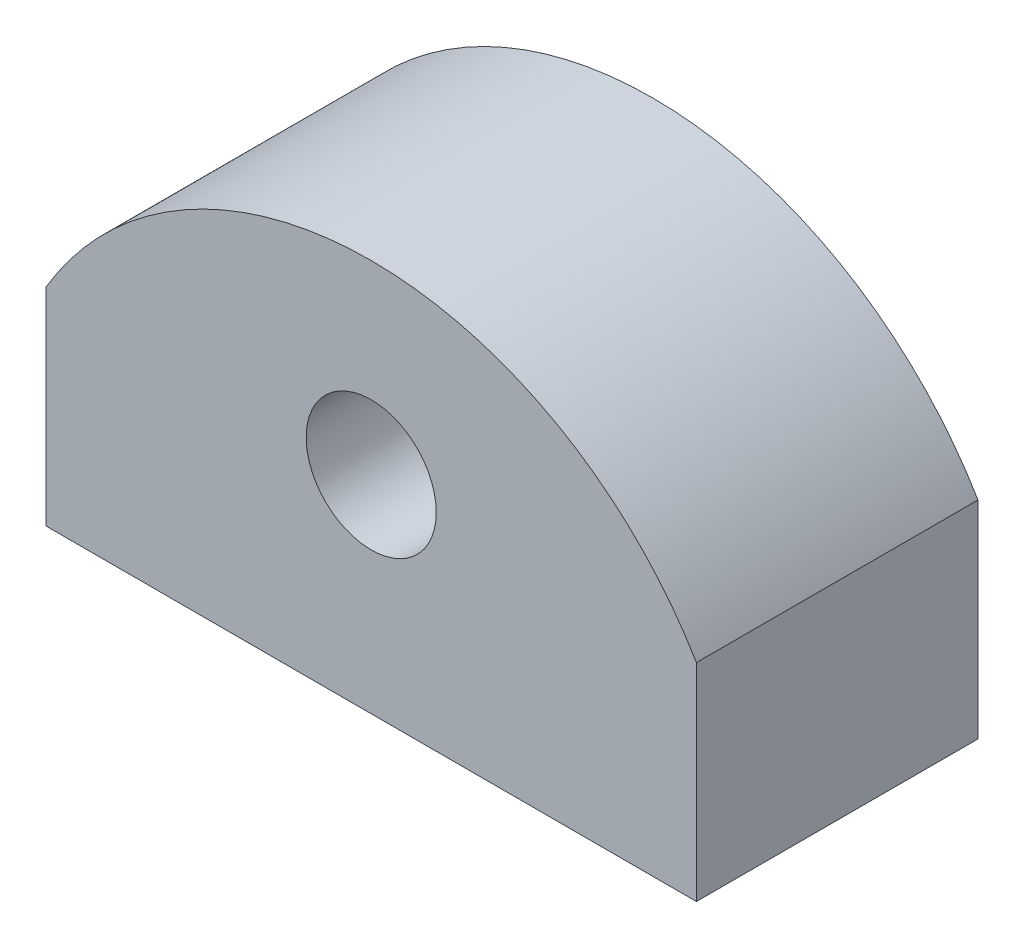
ISO-10303-21;
HEADER;
FILE_DESCRIPTION(('STEP AP214'),'2;1');
FILE_NAME('part.step','',(''),(''),'','','');
FILE_SCHEMA(('AUTOMOTIVE_DESIGN { 1 0 10303 214 1 1 1 1 }'));
ENDSEC;
DATA;
#1=APPLICATION_CONTEXT('core data for automotive mechanical design processes');
#2=APPLICATION_PROTOCOL_DEFINITION('international standard','automotive_design',2000,#1);
#3=PRODUCT_CONTEXT('',#1,'mechanical');
#4=PRODUCT('Part','Part','',(#3));
#5=PRODUCT_RELATED_PRODUCT_CATEGORY('part','',(#4));
#6=PRODUCT_DEFINITION_FORMATION('','',#4);
#7=PRODUCT_DEFINITION_CONTEXT('part definition',#1,'design');
#8=PRODUCT_DEFINITION('design','',#6,#7);
#9=PRODUCT_DEFINITION_SHAPE('','',#8);
#10=(LENGTH_UNIT() NAMED_UNIT(*) SI_UNIT(.MILLI.,.METRE.));
#11=(NAMED_UNIT(*) PLANE_ANGLE_UNIT() SI_UNIT($,.RADIAN.));
#12=(NAMED_UNIT(*) SI_UNIT($,.STERADIAN.) SOLID_ANGLE_UNIT());
#13=UNCERTAINTY_MEASURE_WITH_UNIT(LENGTH_MEASURE(1.E-05),#10,'distance_accuracy_value','');
#14=(GEOMETRIC_REPRESENTATION_CONTEXT(3) GLOBAL_UNCERTAINTY_ASSIGNED_CONTEXT((#13)) GLOBAL_UNIT_ASSIGNED_CONTEXT((#10,
#11,#12)) REPRESENTATION_CONTEXT('',''));
#15=CARTESIAN_POINT('',(0.,0.,0.));
#16=DIRECTION('',(0.,0.,1.));
#17=DIRECTION('',(1.,0.,0.));
#18=AXIS2_PLACEMENT_3D('',#15,#16,#17);
#19=CARTESIAN_POINT('',(11.,3.5,9.525));
#20=DIRECTION('',(-1.,0.,0.));
#21=DIRECTION('',(0.,0.,1.));
#22=AXIS2_PLACEMENT_3D('',#19,#20,#21);
#23=PLANE('',#22);
#24=DIRECTION('',(0.,1.,0.));
#25=VECTOR('',#24,1.);
#26=CARTESIAN_POINT('',(11.,3.5,0.));
#27=LINE('',#26,#25);
#28=CARTESIAN_POINT('',(11.,-3.5,0.));
#29=VERTEX_POINT('',#28);
#30=CARTESIAN_POINT('',(11.,3.5,0.));
#31=VERTEX_POINT('',#30);
#32=EDGE_CURVE('E123',#29,#31,#27,.T.);
#33=ORIENTED_EDGE('',*,*,#32,.T.);
#34=DIRECTION('',(0.,0.,-1.));
#35=VECTOR('',#34,1.);
#36=CARTESIAN_POINT('',(11.,3.5,9.525));
#37=LINE('',#36,#35);
#38=CARTESIAN_POINT('',(11.,3.5,9.525));
#39=VERTEX_POINT('',#38);
#40=EDGE_CURVE('E12',#39,#31,#37,.T.);
#41=ORIENTED_EDGE('',*,*,#40,.F.);
#42=DIRECTION('',(0.,1.,0.));
#43=VECTOR('',#42,1.);
#44=CARTESIAN_POINT('',(11.,3.5,9.525));
#45=LINE('',#44,#43);
#46=CARTESIAN_POINT('',(11.,-3.5,9.525));
#47=VERTEX_POINT('',#46);
#48=EDGE_CURVE('E94',#47,#39,#45,.T.);
#49=ORIENTED_EDGE('',*,*,#48,.F.);
#50=DIRECTION('',(0.,0.,-1.));
#51=VECTOR('',#50,1.);
#52=CARTESIAN_POINT('',(11.,-3.5,9.525));
#53=LINE('',#52,#51);
#54=EDGE_CURVE('E107',#47,#29,#53,.T.);
#55=ORIENTED_EDGE('',*,*,#54,.T.);
#56=EDGE_LOOP('',(#33,#41,#49,#55));
#57=FACE_BOUND('',#56,.T.);
#58=ADVANCED_FACE('F42',(#57),#23,.F.);
#59=CARTESIAN_POINT('',(0.,-3.,9.525));
#60=DIRECTION('',(0.,0.,-1.));
#61=DIRECTION('',(-1.,0.,0.));
#62=AXIS2_PLACEMENT_3D('',#59,#60,#61);
#63=CYLINDRICAL_SURFACE('',#62,12.7769323391806);
#64=CARTESIAN_POINT('',(0.,-3.,0.));
#65=DIRECTION('',(0.,0.,1.));
#66=DIRECTION('',(-1.,0.,0.));
#67=AXIS2_PLACEMENT_3D('',#64,#65,#66);
#68=CIRCLE('',#67,12.7769323391806);
#69=CARTESIAN_POINT('',(-11.,3.5,0.));
#70=VERTEX_POINT('',#69);
#71=EDGE_CURVE('E99',#31,#70,#68,.T.);
#72=ORIENTED_EDGE('',*,*,#71,.T.);
#73=DIRECTION('',(0.,0.,-1.));
#74=VECTOR('',#73,1.);
#75=CARTESIAN_POINT('',(-11.,3.5,9.525));
#76=LINE('',#75,#74);
#77=CARTESIAN_POINT('',(-11.,3.5,9.525));
#78=VERTEX_POINT('',#77);
#79=EDGE_CURVE('E51',#78,#70,#76,.T.);
#80=ORIENTED_EDGE('',*,*,#79,.F.);
#81=CARTESIAN_POINT('',(0.,-3.,9.525));
#82=DIRECTION('',(0.,0.,1.));
#83=DIRECTION('',(-1.,0.,0.));
#84=AXIS2_PLACEMENT_3D('',#81,#82,#83);
#85=CIRCLE('',#84,12.7769323391806);
#86=EDGE_CURVE('E89',#39,#78,#85,.T.);
#87=ORIENTED_EDGE('',*,*,#86,.F.);
#88=ORIENTED_EDGE('',*,*,#40,.T.);
#89=EDGE_LOOP('',(#72,#80,#87,#88));
#90=FACE_BOUND('',#89,.T.);
#91=ADVANCED_FACE('F98',(#90),#63,.T.);
#92=CARTESIAN_POINT('',(-11.,3.5,9.525));
#93=DIRECTION('',(1.,0.,0.));
#94=DIRECTION('',(0.,0.,-1.));
#95=AXIS2_PLACEMENT_3D('',#92,#93,#94);
#96=PLANE('',#95);
#97=DIRECTION('',(0.,-1.,0.));
#98=VECTOR('',#97,1.);
#99=CARTESIAN_POINT('',(-11.,3.5,0.));
#100=LINE('',#99,#98);
#101=CARTESIAN_POINT('',(-11.,-3.5,0.));
#102=VERTEX_POINT('',#101);
#103=EDGE_CURVE('E76',#70,#102,#100,.T.);
#104=ORIENTED_EDGE('',*,*,#103,.T.);
#105=DIRECTION('',(0.,0.,-1.));
#106=VECTOR('',#105,1.);
#107=CARTESIAN_POINT('',(-11.,-3.5,9.525));
#108=LINE('',#107,#106);
#109=CARTESIAN_POINT('',(-11.,-3.5,9.525));
#110=VERTEX_POINT('',#109);
#111=EDGE_CURVE('E101',#110,#102,#108,.T.);
#112=ORIENTED_EDGE('',*,*,#111,.F.);
#113=DIRECTION('',(0.,-1.,0.));
#114=VECTOR('',#113,1.);
#115=CARTESIAN_POINT('',(-11.,3.5,9.525));
#116=LINE('',#115,#114);
#117=EDGE_CURVE('E92',#78,#110,#116,.T.);
#118=ORIENTED_EDGE('',*,*,#117,.F.);
#119=ORIENTED_EDGE('',*,*,#79,.T.);
#120=EDGE_LOOP('',(#104,#112,#118,#119));
#121=FACE_BOUND('',#120,.T.);
#122=ADVANCED_FACE('F102',(#121),#96,.F.);
#123=CARTESIAN_POINT('',(-11.,-3.5,9.525));
#124=DIRECTION('',(0.,1.,0.));
#125=DIRECTION('',(0.,0.,1.));
#126=AXIS2_PLACEMENT_3D('',#123,#124,#125);
#127=PLANE('',#126);
#128=CARTESIAN_POINT('',(-6.,-3.5,4.7625));
#129=DIRECTION('',(0.,-1.,0.));
#130=DIRECTION('',(0.,0.,-1.));
#131=AXIS2_PLACEMENT_3D('',#128,#129,#130);
#132=CIRCLE('',#131,1.75);
#133=CARTESIAN_POINT('',(-6.,-3.5,3.0125));
#134=VERTEX_POINT('',#133);
#135=EDGE_CURVE('E138',#134,#134,#132,.T.);
#136=ORIENTED_EDGE('',*,*,#135,.F.);
#137=EDGE_LOOP('',(#136));
#138=FACE_BOUND('',#137,.T.);
#139=CARTESIAN_POINT('',(6.,-3.5,4.7625));
#140=DIRECTION('',(0.,-1.,0.));
#141=DIRECTION('',(0.,0.,1.));
#142=AXIS2_PLACEMENT_3D('',#139,#140,#141);
#143=CIRCLE('',#142,1.75);
#144=CARTESIAN_POINT('',(6.,-3.5,6.5125));
#145=VERTEX_POINT('',#144);
#146=EDGE_CURVE('E130',#145,#145,#143,.T.);
#147=ORIENTED_EDGE('',*,*,#146,.F.);
#148=EDGE_LOOP('',(#147));
#149=FACE_BOUND('',#148,.T.);
#150=DIRECTION('',(1.,0.,0.));
#151=VECTOR('',#150,1.);
#152=CARTESIAN_POINT('',(-11.,-3.5,0.));
#153=LINE('',#152,#151);
#154=EDGE_CURVE('E82',#102,#29,#153,.T.);
#155=ORIENTED_EDGE('',*,*,#154,.T.);
#156=ORIENTED_EDGE('',*,*,#54,.F.);
#157=DIRECTION('',(1.,0.,0.));
#158=VECTOR('',#157,1.);
#159=CARTESIAN_POINT('',(-11.,-3.5,9.525));
#160=LINE('',#159,#158);
#161=EDGE_CURVE('E59',#110,#47,#160,.T.);
#162=ORIENTED_EDGE('',*,*,#161,.F.);
#163=ORIENTED_EDGE('',*,*,#111,.T.);
#164=EDGE_LOOP('',(#155,#156,#162,#163));
#165=FACE_BOUND('',#164,.T.);
#166=ADVANCED_FACE('F157',(#138,#149,#165),#127,.F.);
#167=CARTESIAN_POINT('',(0.,-3.,9.525));
#168=DIRECTION('',(0.,0.,-1.));
#169=DIRECTION('',(-1.,0.,0.));
#170=AXIS2_PLACEMENT_3D('',#167,#168,#169);
#171=PLANE('',#170);
#172=CARTESIAN_POINT('',(0.,3.5,9.525));
#173=DIRECTION('',(0.,0.,1.));
#174=DIRECTION('',(1.,0.,0.));
#175=AXIS2_PLACEMENT_3D('',#172,#173,#174);
#176=CIRCLE('',#175,2.2);
#177=CARTESIAN_POINT('',(2.2,3.5,9.525));
#178=VERTEX_POINT('',#177);
#179=EDGE_CURVE('E124',#178,#178,#176,.T.);
#180=ORIENTED_EDGE('',*,*,#179,.F.);
#181=EDGE_LOOP('',(#180));
#182=FACE_BOUND('',#181,.T.);
#183=ORIENTED_EDGE('',*,*,#48,.T.);
#184=ORIENTED_EDGE('',*,*,#86,.T.);
#185=ORIENTED_EDGE('',*,*,#117,.T.);
#186=ORIENTED_EDGE('',*,*,#161,.T.);
#187=EDGE_LOOP('',(#183,#184,#185,#186));
#188=FACE_BOUND('',#187,.T.);
#189=ADVANCED_FACE('F90',(#182,#188),#171,.F.);
#190=CARTESIAN_POINT('',(0.,-3.,0.));
#191=DIRECTION('',(0.,0.,-1.));
#192=DIRECTION('',(-1.,0.,0.));
#193=AXIS2_PLACEMENT_3D('',#190,#191,#192);
#194=PLANE('',#193);
#195=CARTESIAN_POINT('',(0.,3.5,0.));
#196=DIRECTION('',(0.,0.,-1.));
#197=DIRECTION('',(-1.,0.,0.));
#198=AXIS2_PLACEMENT_3D('',#195,#196,#197);
#199=CIRCLE('',#198,2.2);
#200=CARTESIAN_POINT('',(-2.2,3.5,0.));
#201=VERTEX_POINT('',#200);
#202=EDGE_CURVE('E120',#201,#201,#199,.F.);
#203=ORIENTED_EDGE('',*,*,#202,.T.);
#204=EDGE_LOOP('',(#203));
#205=FACE_BOUND('',#204,.T.);
#206=ORIENTED_EDGE('',*,*,#32,.F.);
#207=ORIENTED_EDGE('',*,*,#154,.F.);
#208=ORIENTED_EDGE('',*,*,#103,.F.);
#209=ORIENTED_EDGE('',*,*,#71,.F.);
#210=EDGE_LOOP('',(#206,#207,#208,#209));
#211=FACE_BOUND('',#210,.T.);
#212=ADVANCED_FACE('F174',(#205,#211),#194,.T.);
#213=CARTESIAN_POINT('',(0.,3.5,-6.22253967444162));
#214=DIRECTION('',(0.,0.,1.));
#215=DIRECTION('',(1.,0.,0.));
#216=AXIS2_PLACEMENT_3D('',#213,#214,#215);
#217=CYLINDRICAL_SURFACE('',#216,2.2);
#218=ORIENTED_EDGE('',*,*,#179,.T.);
#219=EDGE_LOOP('',(#218));
#220=FACE_BOUND('',#219,.T.);
#221=ORIENTED_EDGE('',*,*,#202,.F.);
#222=EDGE_LOOP('',(#221));
#223=FACE_BOUND('',#222,.T.);
#224=ADVANCED_FACE('F165',(#220,#223),#217,.F.);
#225=CARTESIAN_POINT('',(6.,4.5,4.7625));
#226=DIRECTION('',(0.,-1.,0.));
#227=DIRECTION('',(0.,0.,-1.));
#228=AXIS2_PLACEMENT_3D('',#225,#226,#227);
#229=CYLINDRICAL_SURFACE('',#228,1.75);
#230=CARTESIAN_POINT('',(6.,4.5,4.7625));
#231=DIRECTION('',(0.,-1.,0.));
#232=DIRECTION('',(0.,0.,1.));
#233=AXIS2_PLACEMENT_3D('',#230,#231,#232);
#234=CIRCLE('',#233,1.75);
#235=CARTESIAN_POINT('',(6.,4.5,6.5125));
#236=VERTEX_POINT('',#235);
#237=EDGE_CURVE('E134',#236,#236,#234,.T.);
#238=ORIENTED_EDGE('',*,*,#237,.F.);
#239=EDGE_LOOP('',(#238));
#240=FACE_BOUND('',#239,.T.);
#241=ORIENTED_EDGE('',*,*,#146,.T.);
#242=EDGE_LOOP('',(#241));
#243=FACE_BOUND('',#242,.T.);
#244=ADVANCED_FACE('F163',(#240,#243),#229,.F.);
#245=CARTESIAN_POINT('',(6.,4.5,4.7625));
#246=DIRECTION('',(0.,1.,0.));
#247=DIRECTION('',(0.,0.,1.));
#248=AXIS2_PLACEMENT_3D('',#245,#246,#247);
#249=PLANE('',#248);
#250=ORIENTED_EDGE('',*,*,#237,.T.);
#251=EDGE_LOOP('',(#250));
#252=FACE_BOUND('',#251,.T.);
#253=ADVANCED_FACE('F153',(#252),#249,.F.);
#254=CARTESIAN_POINT('',(-6.,4.5,4.7625));
#255=DIRECTION('',(0.,-1.,0.));
#256=DIRECTION('',(0.,0.,-1.));
#257=AXIS2_PLACEMENT_3D('',#254,#255,#256);
#258=CYLINDRICAL_SURFACE('',#257,1.75);
#259=CARTESIAN_POINT('',(-6.,4.5,4.7625));
#260=DIRECTION('',(0.,-1.,0.));
#261=DIRECTION('',(0.,0.,-1.));
#262=AXIS2_PLACEMENT_3D('',#259,#260,#261);
#263=CIRCLE('',#262,1.75);
#264=CARTESIAN_POINT('',(-6.,4.5,3.0125));
#265=VERTEX_POINT('',#264);
#266=EDGE_CURVE('E129',#265,#265,#263,.T.);
#267=ORIENTED_EDGE('',*,*,#266,.F.);
#268=EDGE_LOOP('',(#267));
#269=FACE_BOUND('',#268,.T.);
#270=ORIENTED_EDGE('',*,*,#135,.T.);
#271=EDGE_LOOP('',(#270));
#272=FACE_BOUND('',#271,.T.);
#273=ADVANCED_FACE('F150',(#269,#272),#258,.F.);
#274=CARTESIAN_POINT('',(-6.,4.5,4.7625));
#275=DIRECTION('',(0.,-1.,0.));
#276=DIRECTION('',(0.,0.,-1.));
#277=AXIS2_PLACEMENT_3D('',#274,#275,#276);
#278=PLANE('',#277);
#279=ORIENTED_EDGE('',*,*,#266,.T.);
#280=EDGE_LOOP('',(#279));
#281=FACE_BOUND('',#280,.T.);
#282=ADVANCED_FACE('F148',(#281),#278,.T.);
#283=CLOSED_SHELL('',(#58,#91,#122,#166,#189,#212,#224,#244,#253,#273,#282));
#284=MANIFOLD_SOLID_BREP('B2',#283);
#285=ADVANCED_BREP_SHAPE_REPRESENTATION('',(#18,#284),#14);
#286=SHAPE_DEFINITION_REPRESENTATION(#9,#285);
ENDSEC;
END-ISO-10303-21;
